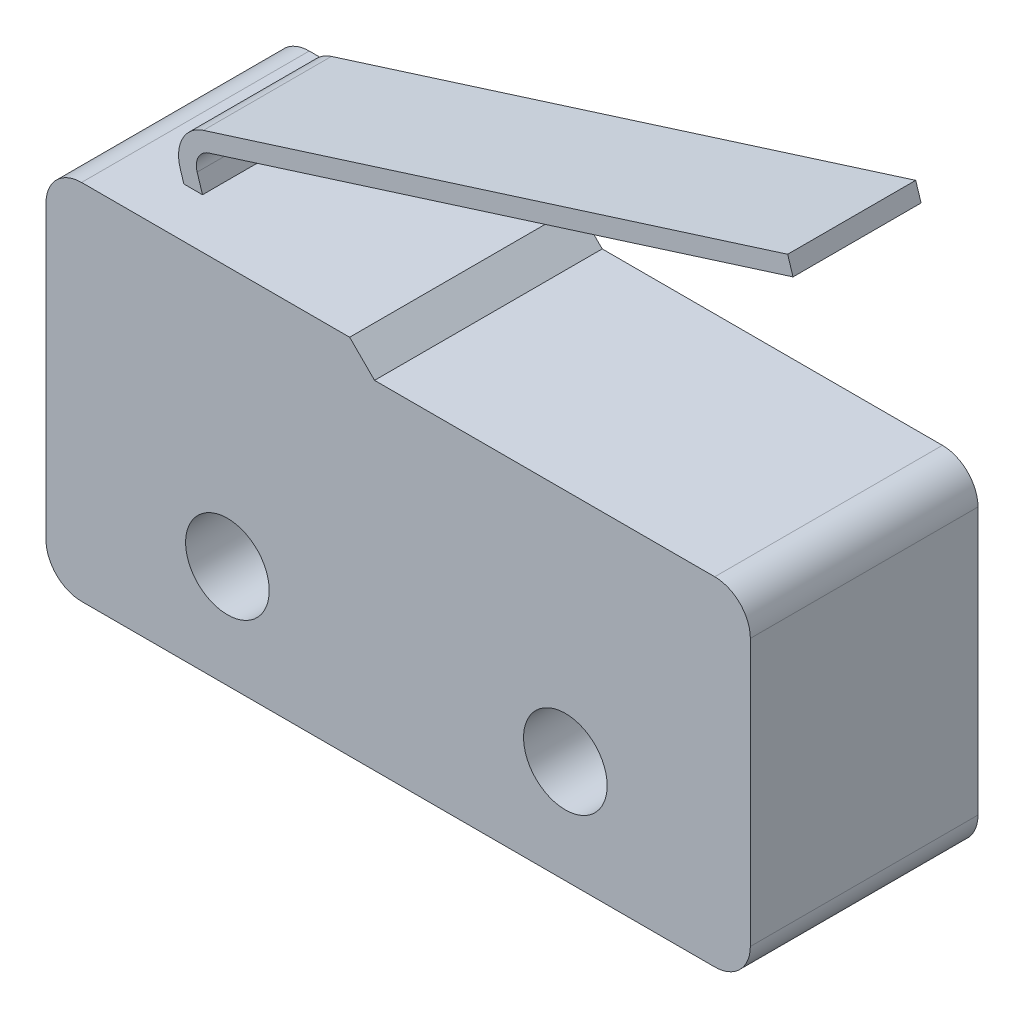
ISO-10303-21;
HEADER;
FILE_DESCRIPTION(('STEP AP214'),'2;1');
FILE_NAME('part.step','',(''),(''),'','','');
FILE_SCHEMA(('AUTOMOTIVE_DESIGN { 1 0 10303 214 1 1 1 1 }'));
ENDSEC;
DATA;
#1=APPLICATION_CONTEXT('core data for automotive mechanical design processes');
#2=APPLICATION_PROTOCOL_DEFINITION('international standard','automotive_design',2000,#1);
#3=PRODUCT_CONTEXT('',#1,'mechanical');
#4=PRODUCT('Part','Part','',(#3));
#5=PRODUCT_RELATED_PRODUCT_CATEGORY('part','',(#4));
#6=PRODUCT_DEFINITION_FORMATION('','',#4);
#7=PRODUCT_DEFINITION_CONTEXT('part definition',#1,'design');
#8=PRODUCT_DEFINITION('design','',#6,#7);
#9=PRODUCT_DEFINITION_SHAPE('','',#8);
#10=(LENGTH_UNIT() NAMED_UNIT(*) SI_UNIT(.MILLI.,.METRE.));
#11=(NAMED_UNIT(*) PLANE_ANGLE_UNIT() SI_UNIT($,.RADIAN.));
#12=(NAMED_UNIT(*) SI_UNIT($,.STERADIAN.) SOLID_ANGLE_UNIT());
#13=UNCERTAINTY_MEASURE_WITH_UNIT(LENGTH_MEASURE(1.E-05),#10,'distance_accuracy_value','');
#14=(GEOMETRIC_REPRESENTATION_CONTEXT(3) GLOBAL_UNCERTAINTY_ASSIGNED_CONTEXT((#13)) GLOBAL_UNIT_ASSIGNED_CONTEXT((#10,
#11,#12)) REPRESENTATION_CONTEXT('',''));
#15=CARTESIAN_POINT('',(0.,0.,0.));
#16=DIRECTION('',(0.,0.,1.));
#17=DIRECTION('',(1.,0.,0.));
#18=AXIS2_PLACEMENT_3D('',#15,#16,#17);
#19=CARTESIAN_POINT('',(1.,9.2,6.4));
#20=DIRECTION('',(0.,0.,-1.));
#21=DIRECTION('',(-1.,0.,0.));
#22=AXIS2_PLACEMENT_3D('',#19,#20,#21);
#23=PLANE('',#22);
#24=DIRECTION('',(-0.707106781186548,0.707106781186548,0.));
#25=VECTOR('',#24,1.);
#26=CARTESIAN_POINT('',(9.23595618705153,9.49999999999999,6.4));
#27=LINE('',#26,#25);
#28=CARTESIAN_POINT('',(9.23595618705153,9.49999999999999,6.4));
#29=VERTEX_POINT('',#28);
#30=CARTESIAN_POINT('',(8.53595618705153,10.2,6.4));
#31=VERTEX_POINT('',#30);
#32=EDGE_CURVE('E239',#29,#31,#27,.T.);
#33=ORIENTED_EDGE('',*,*,#32,.T.);
#34=DIRECTION('',(-1.,0.,0.));
#35=VECTOR('',#34,1.);
#36=CARTESIAN_POINT('',(8.53595618705153,10.2,6.4));
#37=LINE('',#36,#35);
#38=CARTESIAN_POINT('',(1.00000000000001,10.2,6.4));
#39=VERTEX_POINT('',#38);
#40=EDGE_CURVE('E242',#31,#39,#37,.T.);
#41=ORIENTED_EDGE('',*,*,#40,.T.);
#42=CARTESIAN_POINT('',(1.,9.2,6.4));
#43=DIRECTION('',(0.,0.,1.));
#44=DIRECTION('',(-1.,0.,0.));
#45=AXIS2_PLACEMENT_3D('',#42,#43,#44);
#46=CIRCLE('',#45,1.);
#47=CARTESIAN_POINT('',(0.,9.19999999999999,6.4));
#48=VERTEX_POINT('',#47);
#49=EDGE_CURVE('E245',#39,#48,#46,.T.);
#50=ORIENTED_EDGE('',*,*,#49,.T.);
#51=DIRECTION('',(0.,-1.,0.));
#52=VECTOR('',#51,1.);
#53=CARTESIAN_POINT('',(0.,9.19999999999999,6.4));
#54=LINE('',#53,#52);
#55=CARTESIAN_POINT('',(0.,1.00000000000001,6.4));
#56=VERTEX_POINT('',#55);
#57=EDGE_CURVE('E247',#48,#56,#54,.T.);
#58=ORIENTED_EDGE('',*,*,#57,.T.);
#59=CARTESIAN_POINT('',(1.,1.,6.4));
#60=DIRECTION('',(0.,0.,1.));
#61=DIRECTION('',(1.,0.,0.));
#62=AXIS2_PLACEMENT_3D('',#59,#60,#61);
#63=CIRCLE('',#62,1.);
#64=CARTESIAN_POINT('',(1.00000000000001,0.,6.4));
#65=VERTEX_POINT('',#64);
#66=EDGE_CURVE('E249',#56,#65,#63,.T.);
#67=ORIENTED_EDGE('',*,*,#66,.T.);
#68=DIRECTION('',(1.,0.,0.));
#69=VECTOR('',#68,1.);
#70=CARTESIAN_POINT('',(1.00000000000001,0.,6.4));
#71=LINE('',#70,#69);
#72=CARTESIAN_POINT('',(18.8,0.,6.4));
#73=VERTEX_POINT('',#72);
#74=EDGE_CURVE('E251',#65,#73,#71,.T.);
#75=ORIENTED_EDGE('',*,*,#74,.T.);
#76=CARTESIAN_POINT('',(18.8,1.,6.4));
#77=DIRECTION('',(0.,0.,1.));
#78=DIRECTION('',(1.,0.,0.));
#79=AXIS2_PLACEMENT_3D('',#76,#77,#78);
#80=CIRCLE('',#79,1.);
#81=CARTESIAN_POINT('',(19.8,1.00000000000001,6.4));
#82=VERTEX_POINT('',#81);
#83=EDGE_CURVE('E253',#73,#82,#80,.T.);
#84=ORIENTED_EDGE('',*,*,#83,.T.);
#85=DIRECTION('',(0.,1.,0.));
#86=VECTOR('',#85,1.);
#87=CARTESIAN_POINT('',(19.8,1.00000000000001,6.4));
#88=LINE('',#87,#86);
#89=CARTESIAN_POINT('',(19.8,8.49999999999999,6.4));
#90=VERTEX_POINT('',#89);
#91=EDGE_CURVE('E255',#82,#90,#88,.T.);
#92=ORIENTED_EDGE('',*,*,#91,.T.);
#93=CARTESIAN_POINT('',(18.8,8.49999999999999,6.4));
#94=DIRECTION('',(0.,0.,1.));
#95=DIRECTION('',(1.,0.,0.));
#96=AXIS2_PLACEMENT_3D('',#93,#94,#95);
#97=CIRCLE('',#96,1.);
#98=CARTESIAN_POINT('',(18.8,9.49999999999999,6.4));
#99=VERTEX_POINT('',#98);
#100=EDGE_CURVE('E257',#90,#99,#97,.T.);
#101=ORIENTED_EDGE('',*,*,#100,.T.);
#102=DIRECTION('',(-1.,0.,0.));
#103=VECTOR('',#102,1.);
#104=CARTESIAN_POINT('',(18.8,9.49999999999999,6.4));
#105=LINE('',#104,#103);
#106=EDGE_CURVE('E259',#99,#29,#105,.T.);
#107=ORIENTED_EDGE('',*,*,#106,.T.);
#108=EDGE_LOOP('',(#33,#41,#50,#58,#67,#75,#84,#92,#101,#107));
#109=FACE_BOUND('',#108,.T.);
#110=CARTESIAN_POINT('',(5.1,2.9,6.4));
#111=DIRECTION('',(0.,0.,1.));
#112=DIRECTION('',(1.,0.,0.));
#113=AXIS2_PLACEMENT_3D('',#110,#111,#112);
#114=CIRCLE('',#113,1.175);
#115=CARTESIAN_POINT('',(6.275,2.9,6.4));
#116=VERTEX_POINT('',#115);
#117=EDGE_CURVE('E233',#116,#116,#114,.T.);
#118=ORIENTED_EDGE('',*,*,#117,.F.);
#119=EDGE_LOOP('',(#118));
#120=FACE_BOUND('',#119,.T.);
#121=CARTESIAN_POINT('',(14.6,2.9,6.4));
#122=DIRECTION('',(0.,0.,1.));
#123=DIRECTION('',(1.,0.,0.));
#124=AXIS2_PLACEMENT_3D('',#121,#122,#123);
#125=CIRCLE('',#124,1.175);
#126=CARTESIAN_POINT('',(15.775,2.9,6.4));
#127=VERTEX_POINT('',#126);
#128=EDGE_CURVE('E227',#127,#127,#125,.T.);
#129=ORIENTED_EDGE('',*,*,#128,.F.);
#130=EDGE_LOOP('',(#129));
#131=FACE_BOUND('',#130,.T.);
#132=ADVANCED_FACE('F32',(#109,#120,#131),#23,.F.);
#133=CARTESIAN_POINT('',(1.,9.2,0.));
#134=DIRECTION('',(0.,0.,-1.));
#135=DIRECTION('',(-1.,0.,0.));
#136=AXIS2_PLACEMENT_3D('',#133,#134,#135);
#137=PLANE('',#136);
#138=CARTESIAN_POINT('',(5.1,2.9,0.));
#139=DIRECTION('',(0.,0.,1.));
#140=DIRECTION('',(1.,0.,0.));
#141=AXIS2_PLACEMENT_3D('',#138,#139,#140);
#142=CIRCLE('',#141,1.175);
#143=CARTESIAN_POINT('',(6.275,2.9,0.));
#144=VERTEX_POINT('',#143);
#145=EDGE_CURVE('E230',#144,#144,#142,.T.);
#146=ORIENTED_EDGE('',*,*,#145,.T.);
#147=EDGE_LOOP('',(#146));
#148=FACE_BOUND('',#147,.T.);
#149=DIRECTION('',(-0.707106781186548,0.707106781186548,0.));
#150=VECTOR('',#149,1.);
#151=CARTESIAN_POINT('',(9.23595618705153,9.49999999999999,0.));
#152=LINE('',#151,#150);
#153=CARTESIAN_POINT('',(9.23595618705153,9.49999999999999,0.));
#154=VERTEX_POINT('',#153);
#155=CARTESIAN_POINT('',(8.53595618705153,10.2,0.));
#156=VERTEX_POINT('',#155);
#157=EDGE_CURVE('E236',#154,#156,#152,.T.);
#158=ORIENTED_EDGE('',*,*,#157,.F.);
#159=DIRECTION('',(-1.,0.,0.));
#160=VECTOR('',#159,1.);
#161=CARTESIAN_POINT('',(18.8,9.49999999999999,0.));
#162=LINE('',#161,#160);
#163=CARTESIAN_POINT('',(18.8,9.49999999999999,0.));
#164=VERTEX_POINT('',#163);
#165=EDGE_CURVE('E243',#164,#154,#162,.T.);
#166=ORIENTED_EDGE('',*,*,#165,.F.);
#167=CARTESIAN_POINT('',(18.8,8.49999999999999,0.));
#168=DIRECTION('',(0.,0.,1.));
#169=DIRECTION('',(1.,0.,0.));
#170=AXIS2_PLACEMENT_3D('',#167,#168,#169);
#171=CIRCLE('',#170,1.);
#172=CARTESIAN_POINT('',(19.8,8.49999999999999,0.));
#173=VERTEX_POINT('',#172);
#174=EDGE_CURVE('E278',#173,#164,#171,.T.);
#175=ORIENTED_EDGE('',*,*,#174,.F.);
#176=DIRECTION('',(0.,1.,0.));
#177=VECTOR('',#176,1.);
#178=CARTESIAN_POINT('',(19.8,1.00000000000001,0.));
#179=LINE('',#178,#177);
#180=CARTESIAN_POINT('',(19.8,1.00000000000001,0.));
#181=VERTEX_POINT('',#180);
#182=EDGE_CURVE('E276',#181,#173,#179,.T.);
#183=ORIENTED_EDGE('',*,*,#182,.F.);
#184=CARTESIAN_POINT('',(18.8,1.,0.));
#185=DIRECTION('',(0.,0.,1.));
#186=DIRECTION('',(1.,0.,0.));
#187=AXIS2_PLACEMENT_3D('',#184,#185,#186);
#188=CIRCLE('',#187,1.);
#189=CARTESIAN_POINT('',(18.8,0.,0.));
#190=VERTEX_POINT('',#189);
#191=EDGE_CURVE('E274',#190,#181,#188,.T.);
#192=ORIENTED_EDGE('',*,*,#191,.F.);
#193=DIRECTION('',(1.,0.,0.));
#194=VECTOR('',#193,1.);
#195=CARTESIAN_POINT('',(1.00000000000001,0.,0.));
#196=LINE('',#195,#194);
#197=CARTESIAN_POINT('',(1.00000000000001,0.,0.));
#198=VERTEX_POINT('',#197);
#199=EDGE_CURVE('E272',#198,#190,#196,.T.);
#200=ORIENTED_EDGE('',*,*,#199,.F.);
#201=CARTESIAN_POINT('',(1.,1.,0.));
#202=DIRECTION('',(0.,0.,1.));
#203=DIRECTION('',(1.,0.,0.));
#204=AXIS2_PLACEMENT_3D('',#201,#202,#203);
#205=CIRCLE('',#204,1.);
#206=CARTESIAN_POINT('',(0.,1.00000000000001,0.));
#207=VERTEX_POINT('',#206);
#208=EDGE_CURVE('E270',#207,#198,#205,.T.);
#209=ORIENTED_EDGE('',*,*,#208,.F.);
#210=DIRECTION('',(0.,-1.,0.));
#211=VECTOR('',#210,1.);
#212=CARTESIAN_POINT('',(0.,9.19999999999999,0.));
#213=LINE('',#212,#211);
#214=CARTESIAN_POINT('',(0.,9.19999999999999,0.));
#215=VERTEX_POINT('',#214);
#216=EDGE_CURVE('E268',#215,#207,#213,.T.);
#217=ORIENTED_EDGE('',*,*,#216,.F.);
#218=CARTESIAN_POINT('',(1.,9.2,0.));
#219=DIRECTION('',(0.,0.,1.));
#220=DIRECTION('',(-1.,0.,0.));
#221=AXIS2_PLACEMENT_3D('',#218,#219,#220);
#222=CIRCLE('',#221,1.);
#223=CARTESIAN_POINT('',(1.00000000000001,10.2,0.));
#224=VERTEX_POINT('',#223);
#225=EDGE_CURVE('E266',#224,#215,#222,.T.);
#226=ORIENTED_EDGE('',*,*,#225,.F.);
#227=DIRECTION('',(-1.,0.,0.));
#228=VECTOR('',#227,1.);
#229=CARTESIAN_POINT('',(8.53595618705153,10.2,0.));
#230=LINE('',#229,#228);
#231=EDGE_CURVE('E264',#156,#224,#230,.T.);
#232=ORIENTED_EDGE('',*,*,#231,.F.);
#233=EDGE_LOOP('',(#158,#166,#175,#183,#192,#200,#209,#217,#226,#232));
#234=FACE_BOUND('',#233,.T.);
#235=CARTESIAN_POINT('',(14.6,2.9,0.));
#236=DIRECTION('',(0.,0.,1.));
#237=DIRECTION('',(1.,0.,0.));
#238=AXIS2_PLACEMENT_3D('',#235,#236,#237);
#239=CIRCLE('',#238,1.175);
#240=CARTESIAN_POINT('',(15.775,2.9,0.));
#241=VERTEX_POINT('',#240);
#242=EDGE_CURVE('E216',#241,#241,#239,.T.);
#243=ORIENTED_EDGE('',*,*,#242,.T.);
#244=EDGE_LOOP('',(#243));
#245=FACE_BOUND('',#244,.T.);
#246=ADVANCED_FACE('F314',(#148,#234,#245),#137,.T.);
#247=CARTESIAN_POINT('',(9.23595618705153,9.49999999999999,6.4));
#248=DIRECTION('',(-0.707106781186548,-0.707106781186548,0.));
#249=DIRECTION('',(0.707106781186548,-0.707106781186548,0.));
#250=AXIS2_PLACEMENT_3D('',#247,#248,#249);
#251=PLANE('',#250);
#252=ORIENTED_EDGE('',*,*,#157,.T.);
#253=DIRECTION('',(0.,0.,-1.));
#254=VECTOR('',#253,1.);
#255=CARTESIAN_POINT('',(8.53595618705153,10.2,6.4));
#256=LINE('',#255,#254);
#257=EDGE_CURVE('E11',#31,#156,#256,.T.);
#258=ORIENTED_EDGE('',*,*,#257,.F.);
#259=ORIENTED_EDGE('',*,*,#32,.F.);
#260=DIRECTION('',(0.,0.,-1.));
#261=VECTOR('',#260,1.);
#262=CARTESIAN_POINT('',(9.23595618705153,9.49999999999999,6.4));
#263=LINE('',#262,#261);
#264=EDGE_CURVE('E261',#29,#154,#263,.T.);
#265=ORIENTED_EDGE('',*,*,#264,.T.);
#266=EDGE_LOOP('',(#252,#258,#259,#265));
#267=FACE_BOUND('',#266,.T.);
#268=ADVANCED_FACE('F34',(#267),#251,.F.);
#269=CARTESIAN_POINT('',(8.53595618705153,10.2,6.4));
#270=DIRECTION('',(0.,-1.,0.));
#271=DIRECTION('',(0.,0.,-1.));
#272=AXIS2_PLACEMENT_3D('',#269,#270,#271);
#273=PLANE('',#272);
#274=DIRECTION('',(0.,0.,1.));
#275=VECTOR('',#274,1.);
#276=CARTESIAN_POINT('',(2.47557942679102,10.2,1.4));
#277=LINE('',#276,#275);
#278=CARTESIAN_POINT('',(2.47557942679102,10.2,1.4));
#279=VERTEX_POINT('',#278);
#280=CARTESIAN_POINT('',(2.47557942679102,10.2,5.));
#281=VERTEX_POINT('',#280);
#282=EDGE_CURVE('E47',#279,#281,#277,.T.);
#283=ORIENTED_EDGE('',*,*,#282,.F.);
#284=DIRECTION('',(1.,0.,0.));
#285=VECTOR('',#284,1.);
#286=CARTESIAN_POINT('',(3.,10.2,1.4));
#287=LINE('',#286,#285);
#288=CARTESIAN_POINT('',(3.,10.2,1.4));
#289=VERTEX_POINT('',#288);
#290=EDGE_CURVE('E51',#279,#289,#287,.T.);
#291=ORIENTED_EDGE('',*,*,#290,.T.);
#292=DIRECTION('',(0.,0.,1.));
#293=VECTOR('',#292,1.);
#294=CARTESIAN_POINT('',(3.,10.2,1.4));
#295=LINE('',#294,#293);
#296=CARTESIAN_POINT('',(3.,10.2,5.));
#297=VERTEX_POINT('',#296);
#298=EDGE_CURVE('E166',#289,#297,#295,.T.);
#299=ORIENTED_EDGE('',*,*,#298,.T.);
#300=DIRECTION('',(1.,0.,0.));
#301=VECTOR('',#300,1.);
#302=CARTESIAN_POINT('',(3.,10.2,5.));
#303=LINE('',#302,#301);
#304=EDGE_CURVE('E195',#281,#297,#303,.T.);
#305=ORIENTED_EDGE('',*,*,#304,.F.);
#306=EDGE_LOOP('',(#283,#291,#299,#305));
#307=FACE_BOUND('',#306,.T.);
#308=ORIENTED_EDGE('',*,*,#231,.T.);
#309=DIRECTION('',(0.,0.,-1.));
#310=VECTOR('',#309,1.);
#311=CARTESIAN_POINT('',(1.00000000000001,10.2,6.4));
#312=LINE('',#311,#310);
#313=EDGE_CURVE('E40',#39,#224,#312,.T.);
#314=ORIENTED_EDGE('',*,*,#313,.F.);
#315=ORIENTED_EDGE('',*,*,#40,.F.);
#316=ORIENTED_EDGE('',*,*,#257,.T.);
#317=EDGE_LOOP('',(#308,#314,#315,#316));
#318=FACE_BOUND('',#317,.T.);
#319=ADVANCED_FACE('F332',(#307,#318),#273,.F.);
#320=CARTESIAN_POINT('',(1.,9.2,6.4));
#321=DIRECTION('',(0.,0.,-1.));
#322=DIRECTION('',(-1.,0.,0.));
#323=AXIS2_PLACEMENT_3D('',#320,#321,#322);
#324=CYLINDRICAL_SURFACE('',#323,1.);
#325=ORIENTED_EDGE('',*,*,#225,.T.);
#326=DIRECTION('',(0.,0.,-1.));
#327=VECTOR('',#326,1.);
#328=CARTESIAN_POINT('',(0.,9.19999999999999,6.4));
#329=LINE('',#328,#327);
#330=EDGE_CURVE('E301',#48,#215,#329,.T.);
#331=ORIENTED_EDGE('',*,*,#330,.F.);
#332=ORIENTED_EDGE('',*,*,#49,.F.);
#333=ORIENTED_EDGE('',*,*,#313,.T.);
#334=EDGE_LOOP('',(#325,#331,#332,#333));
#335=FACE_BOUND('',#334,.T.);
#336=ADVANCED_FACE('F308',(#335),#324,.T.);
#337=CARTESIAN_POINT('',(0.,9.19999999999999,6.4));
#338=DIRECTION('',(1.,0.,0.));
#339=DIRECTION('',(0.,0.,-1.));
#340=AXIS2_PLACEMENT_3D('',#337,#338,#339);
#341=PLANE('',#340);
#342=ORIENTED_EDGE('',*,*,#216,.T.);
#343=DIRECTION('',(0.,0.,-1.));
#344=VECTOR('',#343,1.);
#345=CARTESIAN_POINT('',(0.,1.00000000000001,6.4));
#346=LINE('',#345,#344);
#347=EDGE_CURVE('E298',#56,#207,#346,.T.);
#348=ORIENTED_EDGE('',*,*,#347,.F.);
#349=ORIENTED_EDGE('',*,*,#57,.F.);
#350=ORIENTED_EDGE('',*,*,#330,.T.);
#351=EDGE_LOOP('',(#342,#348,#349,#350));
#352=FACE_BOUND('',#351,.T.);
#353=ADVANCED_FACE('F320',(#352),#341,.F.);
#354=CARTESIAN_POINT('',(1.,1.,6.4));
#355=DIRECTION('',(0.,0.,-1.));
#356=DIRECTION('',(-1.,0.,0.));
#357=AXIS2_PLACEMENT_3D('',#354,#355,#356);
#358=CYLINDRICAL_SURFACE('',#357,1.);
#359=ORIENTED_EDGE('',*,*,#208,.T.);
#360=DIRECTION('',(0.,0.,-1.));
#361=VECTOR('',#360,1.);
#362=CARTESIAN_POINT('',(1.00000000000001,0.,6.4));
#363=LINE('',#362,#361);
#364=EDGE_CURVE('E295',#65,#198,#363,.T.);
#365=ORIENTED_EDGE('',*,*,#364,.F.);
#366=ORIENTED_EDGE('',*,*,#66,.F.);
#367=ORIENTED_EDGE('',*,*,#347,.T.);
#368=EDGE_LOOP('',(#359,#365,#366,#367));
#369=FACE_BOUND('',#368,.T.);
#370=ADVANCED_FACE('F324',(#369),#358,.T.);
#371=CARTESIAN_POINT('',(1.00000000000001,0.,6.4));
#372=DIRECTION('',(0.,1.,0.));
#373=DIRECTION('',(0.,0.,1.));
#374=AXIS2_PLACEMENT_3D('',#371,#372,#373);
#375=PLANE('',#374);
#376=ORIENTED_EDGE('',*,*,#199,.T.);
#377=DIRECTION('',(0.,0.,-1.));
#378=VECTOR('',#377,1.);
#379=CARTESIAN_POINT('',(18.8,0.,6.4));
#380=LINE('',#379,#378);
#381=EDGE_CURVE('E292',#73,#190,#380,.T.);
#382=ORIENTED_EDGE('',*,*,#381,.F.);
#383=ORIENTED_EDGE('',*,*,#74,.F.);
#384=ORIENTED_EDGE('',*,*,#364,.T.);
#385=EDGE_LOOP('',(#376,#382,#383,#384));
#386=FACE_BOUND('',#385,.T.);
#387=ADVANCED_FACE('F355',(#386),#375,.F.);
#388=CARTESIAN_POINT('',(18.8,1.,6.4));
#389=DIRECTION('',(0.,0.,-1.));
#390=DIRECTION('',(-1.,0.,0.));
#391=AXIS2_PLACEMENT_3D('',#388,#389,#390);
#392=CYLINDRICAL_SURFACE('',#391,1.);
#393=ORIENTED_EDGE('',*,*,#191,.T.);
#394=DIRECTION('',(0.,0.,-1.));
#395=VECTOR('',#394,1.);
#396=CARTESIAN_POINT('',(19.8,1.00000000000001,6.4));
#397=LINE('',#396,#395);
#398=EDGE_CURVE('E289',#82,#181,#397,.T.);
#399=ORIENTED_EDGE('',*,*,#398,.F.);
#400=ORIENTED_EDGE('',*,*,#83,.F.);
#401=ORIENTED_EDGE('',*,*,#381,.T.);
#402=EDGE_LOOP('',(#393,#399,#400,#401));
#403=FACE_BOUND('',#402,.T.);
#404=ADVANCED_FACE('F352',(#403),#392,.T.);
#405=CARTESIAN_POINT('',(19.8,1.00000000000001,6.4));
#406=DIRECTION('',(-1.,0.,0.));
#407=DIRECTION('',(0.,-1.,0.));
#408=AXIS2_PLACEMENT_3D('',#405,#406,#407);
#409=PLANE('',#408);
#410=ORIENTED_EDGE('',*,*,#182,.T.);
#411=DIRECTION('',(0.,0.,-1.));
#412=VECTOR('',#411,1.);
#413=CARTESIAN_POINT('',(19.8,8.49999999999999,6.4));
#414=LINE('',#413,#412);
#415=EDGE_CURVE('E286',#90,#173,#414,.T.);
#416=ORIENTED_EDGE('',*,*,#415,.F.);
#417=ORIENTED_EDGE('',*,*,#91,.F.);
#418=ORIENTED_EDGE('',*,*,#398,.T.);
#419=EDGE_LOOP('',(#410,#416,#417,#418));
#420=FACE_BOUND('',#419,.T.);
#421=ADVANCED_FACE('F348',(#420),#409,.F.);
#422=CARTESIAN_POINT('',(18.8,8.49999999999999,6.4));
#423=DIRECTION('',(0.,0.,-1.));
#424=DIRECTION('',(-1.,0.,0.));
#425=AXIS2_PLACEMENT_3D('',#422,#423,#424);
#426=CYLINDRICAL_SURFACE('',#425,1.);
#427=ORIENTED_EDGE('',*,*,#174,.T.);
#428=DIRECTION('',(0.,0.,-1.));
#429=VECTOR('',#428,1.);
#430=CARTESIAN_POINT('',(18.8,9.49999999999999,6.4));
#431=LINE('',#430,#429);
#432=EDGE_CURVE('E283',#99,#164,#431,.T.);
#433=ORIENTED_EDGE('',*,*,#432,.F.);
#434=ORIENTED_EDGE('',*,*,#100,.F.);
#435=ORIENTED_EDGE('',*,*,#415,.T.);
#436=EDGE_LOOP('',(#427,#433,#434,#435));
#437=FACE_BOUND('',#436,.T.);
#438=ADVANCED_FACE('F344',(#437),#426,.T.);
#439=CARTESIAN_POINT('',(18.8,9.49999999999999,6.4));
#440=DIRECTION('',(0.,-1.,0.));
#441=DIRECTION('',(0.,0.,-1.));
#442=AXIS2_PLACEMENT_3D('',#439,#440,#441);
#443=PLANE('',#442);
#444=ORIENTED_EDGE('',*,*,#165,.T.);
#445=ORIENTED_EDGE('',*,*,#264,.F.);
#446=ORIENTED_EDGE('',*,*,#106,.F.);
#447=ORIENTED_EDGE('',*,*,#432,.T.);
#448=EDGE_LOOP('',(#444,#445,#446,#447));
#449=FACE_BOUND('',#448,.T.);
#450=ADVANCED_FACE('F339',(#449),#443,.F.);
#451=CARTESIAN_POINT('',(5.1,2.9,6.4));
#452=DIRECTION('',(0.,0.,-1.));
#453=DIRECTION('',(-1.,0.,0.));
#454=AXIS2_PLACEMENT_3D('',#451,#452,#453);
#455=CYLINDRICAL_SURFACE('',#454,1.175);
#456=ORIENTED_EDGE('',*,*,#117,.T.);
#457=EDGE_LOOP('',(#456));
#458=FACE_BOUND('',#457,.T.);
#459=ORIENTED_EDGE('',*,*,#145,.F.);
#460=EDGE_LOOP('',(#459));
#461=FACE_BOUND('',#460,.T.);
#462=ADVANCED_FACE('F372',(#458,#461),#455,.F.);
#463=CARTESIAN_POINT('',(14.6,2.9,6.4));
#464=DIRECTION('',(0.,0.,-1.));
#465=DIRECTION('',(-1.,0.,0.));
#466=AXIS2_PLACEMENT_3D('',#463,#464,#465);
#467=CYLINDRICAL_SURFACE('',#466,1.175);
#468=ORIENTED_EDGE('',*,*,#128,.T.);
#469=EDGE_LOOP('',(#468));
#470=FACE_BOUND('',#469,.T.);
#471=ORIENTED_EDGE('',*,*,#242,.F.);
#472=EDGE_LOOP('',(#471));
#473=FACE_BOUND('',#472,.T.);
#474=ADVANCED_FACE('F398',(#470,#473),#467,.F.);
#475=CARTESIAN_POINT('',(2.47557942679102,10.2,1.4));
#476=DIRECTION('',(-0.953433228106312,-0.301604176931914,0.));
#477=DIRECTION('',(0.301604176931914,-0.953433228106312,0.));
#478=AXIS2_PLACEMENT_3D('',#475,#476,#477);
#479=PLANE('',#478);
#480=DIRECTION('',(0.301604176931914,-0.953433228106312,0.));
#481=VECTOR('',#480,1.);
#482=CARTESIAN_POINT('',(2.47557942679102,10.2,5.));
#483=LINE('',#482,#481);
#484=CARTESIAN_POINT('',(2.37248129748089,10.5259145255872,5.));
#485=VERTEX_POINT('',#484);
#486=EDGE_CURVE('E179',#485,#281,#483,.T.);
#487=ORIENTED_EDGE('',*,*,#486,.F.);
#488=DIRECTION('',(0.,0.,1.));
#489=VECTOR('',#488,1.);
#490=CARTESIAN_POINT('',(2.37248129748089,10.5259145255872,1.4));
#491=LINE('',#490,#489);
#492=CARTESIAN_POINT('',(2.37248129748089,10.5259145255872,1.4));
#493=VERTEX_POINT('',#492);
#494=EDGE_CURVE('E217',#493,#485,#491,.T.);
#495=ORIENTED_EDGE('',*,*,#494,.F.);
#496=DIRECTION('',(0.301604176931914,-0.953433228106312,0.));
#497=VECTOR('',#496,1.);
#498=CARTESIAN_POINT('',(2.47557942679102,10.2,1.4));
#499=LINE('',#498,#497);
#500=EDGE_CURVE('E192',#493,#279,#499,.T.);
#501=ORIENTED_EDGE('',*,*,#500,.T.);
#502=ORIENTED_EDGE('',*,*,#282,.T.);
#503=EDGE_LOOP('',(#487,#495,#501,#502));
#504=FACE_BOUND('',#503,.T.);
#505=ADVANCED_FACE('F405',(#504),#479,.T.);
#506=CARTESIAN_POINT('',(3.3259145255872,10.8275187025191,1.4));
#507=DIRECTION('',(0.,0.,1.));
#508=DIRECTION('',(1.,0.,0.));
#509=AXIS2_PLACEMENT_3D('',#506,#507,#508);
#510=CYLINDRICAL_SURFACE('',#509,1.);
#511=CARTESIAN_POINT('',(3.3259145255872,10.8275187025191,5.));
#512=DIRECTION('',(0.,0.,1.));
#513=DIRECTION('',(-1.,0.,0.));
#514=AXIS2_PLACEMENT_3D('',#511,#512,#513);
#515=CIRCLE('',#514,1.);
#516=CARTESIAN_POINT('',(3.02431034865529,11.7809519306254,5.));
#517=VERTEX_POINT('',#516);
#518=EDGE_CURVE('E210',#517,#485,#515,.T.);
#519=ORIENTED_EDGE('',*,*,#518,.F.);
#520=DIRECTION('',(0.,0.,1.));
#521=VECTOR('',#520,1.);
#522=CARTESIAN_POINT('',(3.02431034865529,11.7809519306254,1.4));
#523=LINE('',#522,#521);
#524=CARTESIAN_POINT('',(3.02431034865529,11.7809519306254,1.4));
#525=VERTEX_POINT('',#524);
#526=EDGE_CURVE('E219',#525,#517,#523,.T.);
#527=ORIENTED_EDGE('',*,*,#526,.F.);
#528=CARTESIAN_POINT('',(3.3259145255872,10.8275187025191,1.4));
#529=DIRECTION('',(0.,0.,1.));
#530=DIRECTION('',(-1.,0.,0.));
#531=AXIS2_PLACEMENT_3D('',#528,#529,#530);
#532=CIRCLE('',#531,1.);
#533=EDGE_CURVE('E189',#525,#493,#532,.T.);
#534=ORIENTED_EDGE('',*,*,#533,.T.);
#535=ORIENTED_EDGE('',*,*,#494,.T.);
#536=EDGE_LOOP('',(#519,#527,#534,#535));
#537=FACE_BOUND('',#536,.T.);
#538=ADVANCED_FACE('F413',(#537),#510,.T.);
#539=CARTESIAN_POINT('',(3.02431034865529,11.7809519306254,1.4));
#540=DIRECTION('',(-0.301604176931914,0.953433228106312,0.));
#541=DIRECTION('',(-0.953433228106312,-0.301604176931914,0.));
#542=AXIS2_PLACEMENT_3D('',#539,#540,#541);
#543=PLANE('',#542);
#544=DIRECTION('',(-0.953433228106312,-0.301604176931914,0.));
#545=VECTOR('',#544,1.);
#546=CARTESIAN_POINT('',(3.02431034865529,11.7809519306254,5.));
#547=LINE('',#546,#545);
#548=CARTESIAN_POINT('',(19.449197911534,16.9767166140532,5.));
#549=VERTEX_POINT('',#548);
#550=EDGE_CURVE('E207',#549,#517,#547,.T.);
#551=ORIENTED_EDGE('',*,*,#550,.F.);
#552=DIRECTION('',(0.,0.,1.));
#553=VECTOR('',#552,1.);
#554=CARTESIAN_POINT('',(19.449197911534,16.9767166140532,1.4));
#555=LINE('',#554,#553);
#556=CARTESIAN_POINT('',(19.449197911534,16.9767166140532,1.4));
#557=VERTEX_POINT('',#556);
#558=EDGE_CURVE('E221',#557,#549,#555,.T.);
#559=ORIENTED_EDGE('',*,*,#558,.F.);
#560=DIRECTION('',(-0.953433228106312,-0.301604176931914,0.));
#561=VECTOR('',#560,1.);
#562=CARTESIAN_POINT('',(3.02431034865529,11.7809519306254,1.4));
#563=LINE('',#562,#561);
#564=EDGE_CURVE('E186',#557,#525,#563,.T.);
#565=ORIENTED_EDGE('',*,*,#564,.T.);
#566=ORIENTED_EDGE('',*,*,#526,.T.);
#567=EDGE_LOOP('',(#551,#559,#565,#566));
#568=FACE_BOUND('',#567,.T.);
#569=ADVANCED_FACE('F421',(#568),#543,.T.);
#570=CARTESIAN_POINT('',(19.449197911534,16.9767166140532,1.4));
#571=DIRECTION('',(0.953433228106304,0.301604176931939,0.));
#572=DIRECTION('',(-0.301604176931939,0.953433228106304,0.));
#573=AXIS2_PLACEMENT_3D('',#570,#571,#572);
#574=PLANE('',#573);
#575=DIRECTION('',(-0.301604176931939,0.953433228106304,0.));
#576=VECTOR('',#575,1.);
#577=CARTESIAN_POINT('',(19.449197911534,16.9767166140532,5.));
#578=LINE('',#577,#576);
#579=CARTESIAN_POINT('',(19.6,16.5,5.));
#580=VERTEX_POINT('',#579);
#581=EDGE_CURVE('E204',#580,#549,#578,.T.);
#582=ORIENTED_EDGE('',*,*,#581,.F.);
#583=DIRECTION('',(0.,0.,1.));
#584=VECTOR('',#583,1.);
#585=CARTESIAN_POINT('',(19.6,16.5,1.4));
#586=LINE('',#585,#584);
#587=CARTESIAN_POINT('',(19.6,16.5,1.4));
#588=VERTEX_POINT('',#587);
#589=EDGE_CURVE('E223',#588,#580,#586,.T.);
#590=ORIENTED_EDGE('',*,*,#589,.F.);
#591=DIRECTION('',(-0.301604176931939,0.953433228106304,0.));
#592=VECTOR('',#591,1.);
#593=CARTESIAN_POINT('',(19.449197911534,16.9767166140532,1.4));
#594=LINE('',#593,#592);
#595=EDGE_CURVE('E183',#588,#557,#594,.T.);
#596=ORIENTED_EDGE('',*,*,#595,.T.);
#597=ORIENTED_EDGE('',*,*,#558,.T.);
#598=EDGE_LOOP('',(#582,#590,#596,#597));
#599=FACE_BOUND('',#598,.T.);
#600=ADVANCED_FACE('F429',(#599),#574,.T.);
#601=CARTESIAN_POINT('',(19.6,16.5,1.4));
#602=DIRECTION('',(0.301604176931914,-0.953433228106312,0.));
#603=DIRECTION('',(0.953433228106312,0.301604176931914,0.));
#604=AXIS2_PLACEMENT_3D('',#601,#602,#603);
#605=PLANE('',#604);
#606=DIRECTION('',(0.953433228106312,0.301604176931914,0.));
#607=VECTOR('',#606,1.);
#608=CARTESIAN_POINT('',(19.6,16.5,5.));
#609=LINE('',#608,#607);
#610=CARTESIAN_POINT('',(3.17511243712125,11.3042353165723,5.));
#611=VERTEX_POINT('',#610);
#612=EDGE_CURVE('E201',#611,#580,#609,.T.);
#613=ORIENTED_EDGE('',*,*,#612,.F.);
#614=DIRECTION('',(0.,0.,1.));
#615=VECTOR('',#614,1.);
#616=CARTESIAN_POINT('',(3.17511243712125,11.3042353165723,1.4));
#617=LINE('',#616,#615);
#618=CARTESIAN_POINT('',(3.17511243712125,11.3042353165723,1.4));
#619=VERTEX_POINT('',#618);
#620=EDGE_CURVE('E165',#619,#611,#617,.T.);
#621=ORIENTED_EDGE('',*,*,#620,.F.);
#622=DIRECTION('',(0.953433228106312,0.301604176931914,0.));
#623=VECTOR('',#622,1.);
#624=CARTESIAN_POINT('',(19.6,16.5,1.4));
#625=LINE('',#624,#623);
#626=EDGE_CURVE('E175',#619,#588,#625,.T.);
#627=ORIENTED_EDGE('',*,*,#626,.T.);
#628=ORIENTED_EDGE('',*,*,#589,.T.);
#629=EDGE_LOOP('',(#613,#621,#627,#628));
#630=FACE_BOUND('',#629,.T.);
#631=ADVANCED_FACE('F437',(#630),#605,.T.);
#632=CARTESIAN_POINT('',(3.3259145255872,10.8275187025191,1.4));
#633=DIRECTION('',(0.,0.,1.));
#634=DIRECTION('',(1.,0.,0.));
#635=AXIS2_PLACEMENT_3D('',#632,#633,#634);
#636=CYLINDRICAL_SURFACE('',#635,0.5);
#637=CARTESIAN_POINT('',(3.3259145255872,10.8275187025191,5.));
#638=DIRECTION('',(0.,0.,-1.));
#639=DIRECTION('',(-1.,0.,0.));
#640=AXIS2_PLACEMENT_3D('',#637,#638,#639);
#641=CIRCLE('',#640,0.5);
#642=CARTESIAN_POINT('',(2.84919791153405,10.6767166140531,5.));
#643=VERTEX_POINT('',#642);
#644=EDGE_CURVE('E160',#643,#611,#641,.T.);
#645=ORIENTED_EDGE('',*,*,#644,.F.);
#646=DIRECTION('',(0.,0.,1.));
#647=VECTOR('',#646,1.);
#648=CARTESIAN_POINT('',(2.84919791153405,10.6767166140531,1.4));
#649=LINE('',#648,#647);
#650=CARTESIAN_POINT('',(2.84919791153405,10.6767166140531,1.4));
#651=VERTEX_POINT('',#650);
#652=EDGE_CURVE('E155',#651,#643,#649,.T.);
#653=ORIENTED_EDGE('',*,*,#652,.F.);
#654=CARTESIAN_POINT('',(3.3259145255872,10.8275187025191,1.4));
#655=DIRECTION('',(0.,0.,-1.));
#656=DIRECTION('',(-1.,0.,0.));
#657=AXIS2_PLACEMENT_3D('',#654,#655,#656);
#658=CIRCLE('',#657,0.5);
#659=EDGE_CURVE('E158',#651,#619,#658,.T.);
#660=ORIENTED_EDGE('',*,*,#659,.T.);
#661=ORIENTED_EDGE('',*,*,#620,.T.);
#662=EDGE_LOOP('',(#645,#653,#660,#661));
#663=FACE_BOUND('',#662,.T.);
#664=ADVANCED_FACE('F157',(#663),#636,.F.);
#665=CARTESIAN_POINT('',(2.84919791153405,10.6767166140531,1.4));
#666=DIRECTION('',(0.953433228106312,0.301604176931914,0.));
#667=DIRECTION('',(-0.301604176931914,0.953433228106312,0.));
#668=AXIS2_PLACEMENT_3D('',#665,#666,#667);
#669=PLANE('',#668);
#670=DIRECTION('',(-0.301604176931914,0.953433228106312,0.));
#671=VECTOR('',#670,1.);
#672=CARTESIAN_POINT('',(2.84919791153405,10.6767166140531,5.));
#673=LINE('',#672,#671);
#674=EDGE_CURVE('E198',#297,#643,#673,.T.);
#675=ORIENTED_EDGE('',*,*,#674,.F.);
#676=ORIENTED_EDGE('',*,*,#298,.F.);
#677=DIRECTION('',(-0.301604176931914,0.953433228106312,0.));
#678=VECTOR('',#677,1.);
#679=CARTESIAN_POINT('',(2.84919791153405,10.6767166140531,1.4));
#680=LINE('',#679,#678);
#681=EDGE_CURVE('E172',#289,#651,#680,.T.);
#682=ORIENTED_EDGE('',*,*,#681,.T.);
#683=ORIENTED_EDGE('',*,*,#652,.T.);
#684=EDGE_LOOP('',(#675,#676,#682,#683));
#685=FACE_BOUND('',#684,.T.);
#686=ADVANCED_FACE('F177',(#685),#669,.T.);
#687=CARTESIAN_POINT('',(3.3259145255872,10.8275187025191,1.4));
#688=DIRECTION('',(0.,0.,-1.));
#689=DIRECTION('',(-1.,0.,0.));
#690=AXIS2_PLACEMENT_3D('',#687,#688,#689);
#691=PLANE('',#690);
#692=ORIENTED_EDGE('',*,*,#290,.F.);
#693=ORIENTED_EDGE('',*,*,#500,.F.);
#694=ORIENTED_EDGE('',*,*,#533,.F.);
#695=ORIENTED_EDGE('',*,*,#564,.F.);
#696=ORIENTED_EDGE('',*,*,#595,.F.);
#697=ORIENTED_EDGE('',*,*,#626,.F.);
#698=ORIENTED_EDGE('',*,*,#659,.F.);
#699=ORIENTED_EDGE('',*,*,#681,.F.);
#700=EDGE_LOOP('',(#692,#693,#694,#695,#696,#697,#698,#699));
#701=FACE_BOUND('',#700,.T.);
#702=ADVANCED_FACE('F171',(#701),#691,.T.);
#703=CARTESIAN_POINT('',(3.3259145255872,10.8275187025191,5.));
#704=DIRECTION('',(0.,0.,-1.));
#705=DIRECTION('',(-1.,0.,0.));
#706=AXIS2_PLACEMENT_3D('',#703,#704,#705);
#707=PLANE('',#706);
#708=ORIENTED_EDGE('',*,*,#304,.T.);
#709=ORIENTED_EDGE('',*,*,#674,.T.);
#710=ORIENTED_EDGE('',*,*,#644,.T.);
#711=ORIENTED_EDGE('',*,*,#612,.T.);
#712=ORIENTED_EDGE('',*,*,#581,.T.);
#713=ORIENTED_EDGE('',*,*,#550,.T.);
#714=ORIENTED_EDGE('',*,*,#518,.T.);
#715=ORIENTED_EDGE('',*,*,#486,.T.);
#716=EDGE_LOOP('',(#708,#709,#710,#711,#712,#713,#714,#715));
#717=FACE_BOUND('',#716,.T.);
#718=ADVANCED_FACE('F464',(#717),#707,.F.);
#719=CLOSED_SHELL('',(#132,#246,#268,#319,#336,#353,#370,#387,#404,#421,#438,#450,#462,#474,
#505,#538,#569,#600,#631,#664,#686,#702,#718));
#720=MANIFOLD_SOLID_BREP('B2',#719);
#721=ADVANCED_BREP_SHAPE_REPRESENTATION('',(#18,#720),#14);
#722=SHAPE_DEFINITION_REPRESENTATION(#9,#721);
ENDSEC;
END-ISO-10303-21;
